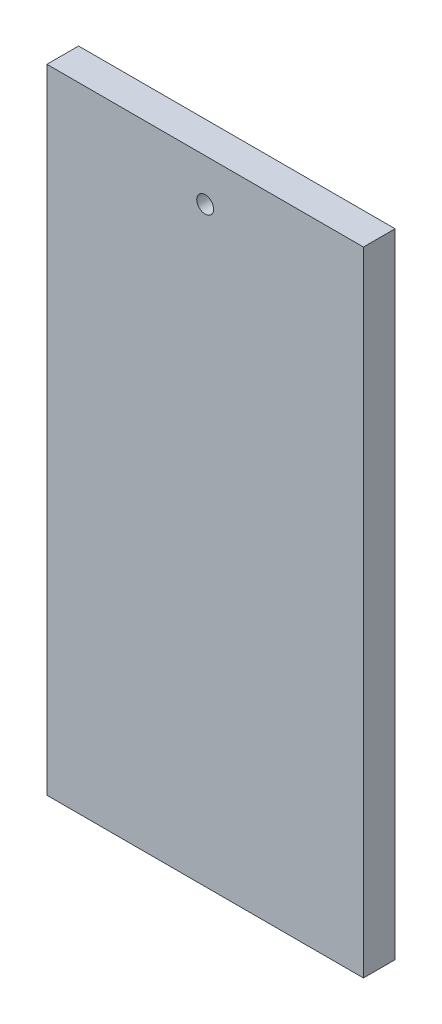
ISO-10303-21;
HEADER;
FILE_DESCRIPTION(('STEP AP214'),'2;1');
FILE_NAME('part.step','',(''),(''),'','','');
FILE_SCHEMA(('AUTOMOTIVE_DESIGN { 1 0 10303 214 1 1 1 1 }'));
ENDSEC;
DATA;
#1=APPLICATION_CONTEXT('core data for automotive mechanical design processes');
#2=APPLICATION_PROTOCOL_DEFINITION('international standard','automotive_design',2000,#1);
#3=PRODUCT_CONTEXT('',#1,'mechanical');
#4=PRODUCT('Part','Part','',(#3));
#5=PRODUCT_RELATED_PRODUCT_CATEGORY('part','',(#4));
#6=PRODUCT_DEFINITION_FORMATION('','',#4);
#7=PRODUCT_DEFINITION_CONTEXT('part definition',#1,'design');
#8=PRODUCT_DEFINITION('design','',#6,#7);
#9=PRODUCT_DEFINITION_SHAPE('','',#8);
#10=(LENGTH_UNIT() NAMED_UNIT(*) SI_UNIT(.MILLI.,.METRE.));
#11=(NAMED_UNIT(*) PLANE_ANGLE_UNIT() SI_UNIT($,.RADIAN.));
#12=(NAMED_UNIT(*) SI_UNIT($,.STERADIAN.) SOLID_ANGLE_UNIT());
#13=UNCERTAINTY_MEASURE_WITH_UNIT(LENGTH_MEASURE(1.E-05),#10,'distance_accuracy_value','');
#14=(GEOMETRIC_REPRESENTATION_CONTEXT(3) GLOBAL_UNCERTAINTY_ASSIGNED_CONTEXT((#13)) GLOBAL_UNIT_ASSIGNED_CONTEXT((#10,
#11,#12)) REPRESENTATION_CONTEXT('',''));
#15=CARTESIAN_POINT('',(0.,0.,0.));
#16=DIRECTION('',(0.,0.,1.));
#17=DIRECTION('',(1.,0.,0.));
#18=AXIS2_PLACEMENT_3D('',#15,#16,#17);
#19=CARTESIAN_POINT('',(0.,0.,15.));
#20=DIRECTION('',(0.,0.,1.));
#21=DIRECTION('',(1.,0.,0.));
#22=AXIS2_PLACEMENT_3D('',#19,#20,#21);
#23=PLANE('',#22);
#24=DIRECTION('',(0.,-1.,0.));
#25=VECTOR('',#24,1.);
#26=CARTESIAN_POINT('',(-75.,-150.,15.));
#27=LINE('',#26,#25);
#28=CARTESIAN_POINT('',(-75.,150.,15.));
#29=VERTEX_POINT('',#28);
#30=CARTESIAN_POINT('',(-75.,-150.,15.));
#31=VERTEX_POINT('',#30);
#32=EDGE_CURVE('E89',#29,#31,#27,.T.);
#33=ORIENTED_EDGE('',*,*,#32,.T.);
#34=DIRECTION('',(1.,0.,0.));
#35=VECTOR('',#34,1.);
#36=CARTESIAN_POINT('',(75.,-150.,15.));
#37=LINE('',#36,#35);
#38=CARTESIAN_POINT('',(75.,-150.,15.));
#39=VERTEX_POINT('',#38);
#40=EDGE_CURVE('E84',#31,#39,#37,.T.);
#41=ORIENTED_EDGE('',*,*,#40,.T.);
#42=DIRECTION('',(0.,1.,0.));
#43=VECTOR('',#42,1.);
#44=CARTESIAN_POINT('',(75.,-150.,15.));
#45=LINE('',#44,#43);
#46=CARTESIAN_POINT('',(75.,150.,15.));
#47=VERTEX_POINT('',#46);
#48=EDGE_CURVE('E87',#39,#47,#45,.T.);
#49=ORIENTED_EDGE('',*,*,#48,.T.);
#50=DIRECTION('',(-1.,0.,0.));
#51=VECTOR('',#50,1.);
#52=CARTESIAN_POINT('',(75.,150.,15.));
#53=LINE('',#52,#51);
#54=EDGE_CURVE('E54',#47,#29,#53,.T.);
#55=ORIENTED_EDGE('',*,*,#54,.T.);
#56=EDGE_LOOP('',(#33,#41,#49,#55));
#57=FACE_BOUND('',#56,.T.);
#58=CARTESIAN_POINT('',(0.,130.,15.));
#59=DIRECTION('',(0.,0.,1.));
#60=DIRECTION('',(1.,0.,0.));
#61=AXIS2_PLACEMENT_3D('',#58,#59,#60);
#62=CIRCLE('',#61,4.);
#63=CARTESIAN_POINT('',(4.,130.,15.));
#64=VERTEX_POINT('',#63);
#65=EDGE_CURVE('E104',#64,#64,#62,.T.);
#66=ORIENTED_EDGE('',*,*,#65,.F.);
#67=EDGE_LOOP('',(#66));
#68=FACE_BOUND('',#67,.T.);
#69=ADVANCED_FACE('F37',(#57,#68),#23,.T.);
#70=CARTESIAN_POINT('',(0.,0.,0.));
#71=DIRECTION('',(0.,0.,1.));
#72=DIRECTION('',(1.,0.,0.));
#73=AXIS2_PLACEMENT_3D('',#70,#71,#72);
#74=PLANE('',#73);
#75=DIRECTION('',(0.,-1.,0.));
#76=VECTOR('',#75,1.);
#77=CARTESIAN_POINT('',(-75.,-150.,0.));
#78=LINE('',#77,#76);
#79=CARTESIAN_POINT('',(-75.,150.,0.));
#80=VERTEX_POINT('',#79);
#81=CARTESIAN_POINT('',(-75.,-150.,0.));
#82=VERTEX_POINT('',#81);
#83=EDGE_CURVE('E101',#80,#82,#78,.T.);
#84=ORIENTED_EDGE('',*,*,#83,.F.);
#85=DIRECTION('',(-1.,0.,0.));
#86=VECTOR('',#85,1.);
#87=CARTESIAN_POINT('',(75.,150.,0.));
#88=LINE('',#87,#86);
#89=CARTESIAN_POINT('',(75.,150.,0.));
#90=VERTEX_POINT('',#89);
#91=EDGE_CURVE('E77',#90,#80,#88,.T.);
#92=ORIENTED_EDGE('',*,*,#91,.F.);
#93=DIRECTION('',(0.,1.,0.));
#94=VECTOR('',#93,1.);
#95=CARTESIAN_POINT('',(75.,-150.,0.));
#96=LINE('',#95,#94);
#97=CARTESIAN_POINT('',(75.,-150.,0.));
#98=VERTEX_POINT('',#97);
#99=EDGE_CURVE('E71',#98,#90,#96,.T.);
#100=ORIENTED_EDGE('',*,*,#99,.F.);
#101=DIRECTION('',(1.,0.,0.));
#102=VECTOR('',#101,1.);
#103=CARTESIAN_POINT('',(75.,-150.,0.));
#104=LINE('',#103,#102);
#105=EDGE_CURVE('E93',#82,#98,#104,.T.);
#106=ORIENTED_EDGE('',*,*,#105,.F.);
#107=EDGE_LOOP('',(#84,#92,#100,#106));
#108=FACE_BOUND('',#107,.T.);
#109=CARTESIAN_POINT('',(0.,130.,0.));
#110=DIRECTION('',(0.,0.,1.));
#111=DIRECTION('',(1.,0.,0.));
#112=AXIS2_PLACEMENT_3D('',#109,#110,#111);
#113=CIRCLE('',#112,4.);
#114=CARTESIAN_POINT('',(4.,130.,0.));
#115=VERTEX_POINT('',#114);
#116=EDGE_CURVE('E116',#115,#115,#113,.T.);
#117=ORIENTED_EDGE('',*,*,#116,.T.);
#118=EDGE_LOOP('',(#117));
#119=FACE_BOUND('',#118,.T.);
#120=ADVANCED_FACE('F112',(#108,#119),#74,.F.);
#121=CARTESIAN_POINT('',(-75.,-150.,15.));
#122=DIRECTION('',(1.,0.,0.));
#123=DIRECTION('',(0.,0.,-1.));
#124=AXIS2_PLACEMENT_3D('',#121,#122,#123);
#125=PLANE('',#124);
#126=ORIENTED_EDGE('',*,*,#83,.T.);
#127=DIRECTION('',(0.,0.,-1.));
#128=VECTOR('',#127,1.);
#129=CARTESIAN_POINT('',(-75.,-150.,15.));
#130=LINE('',#129,#128);
#131=EDGE_CURVE('E11',#31,#82,#130,.T.);
#132=ORIENTED_EDGE('',*,*,#131,.F.);
#133=ORIENTED_EDGE('',*,*,#32,.F.);
#134=DIRECTION('',(0.,0.,-1.));
#135=VECTOR('',#134,1.);
#136=CARTESIAN_POINT('',(-75.,150.,15.));
#137=LINE('',#136,#135);
#138=EDGE_CURVE('E97',#29,#80,#137,.T.);
#139=ORIENTED_EDGE('',*,*,#138,.T.);
#140=EDGE_LOOP('',(#126,#132,#133,#139));
#141=FACE_BOUND('',#140,.T.);
#142=ADVANCED_FACE('F39',(#141),#125,.F.);
#143=CARTESIAN_POINT('',(75.,-150.,15.));
#144=DIRECTION('',(0.,1.,0.));
#145=DIRECTION('',(0.,0.,1.));
#146=AXIS2_PLACEMENT_3D('',#143,#144,#145);
#147=PLANE('',#146);
#148=ORIENTED_EDGE('',*,*,#105,.T.);
#149=DIRECTION('',(0.,0.,-1.));
#150=VECTOR('',#149,1.);
#151=CARTESIAN_POINT('',(75.,-150.,15.));
#152=LINE('',#151,#150);
#153=EDGE_CURVE('E46',#39,#98,#152,.T.);
#154=ORIENTED_EDGE('',*,*,#153,.F.);
#155=ORIENTED_EDGE('',*,*,#40,.F.);
#156=ORIENTED_EDGE('',*,*,#131,.T.);
#157=EDGE_LOOP('',(#148,#154,#155,#156));
#158=FACE_BOUND('',#157,.T.);
#159=ADVANCED_FACE('F92',(#158),#147,.F.);
#160=CARTESIAN_POINT('',(75.,-150.,15.));
#161=DIRECTION('',(-1.,0.,0.));
#162=DIRECTION('',(0.,0.,1.));
#163=AXIS2_PLACEMENT_3D('',#160,#161,#162);
#164=PLANE('',#163);
#165=ORIENTED_EDGE('',*,*,#99,.T.);
#166=DIRECTION('',(0.,0.,-1.));
#167=VECTOR('',#166,1.);
#168=CARTESIAN_POINT('',(75.,150.,15.));
#169=LINE('',#168,#167);
#170=EDGE_CURVE('E94',#47,#90,#169,.T.);
#171=ORIENTED_EDGE('',*,*,#170,.F.);
#172=ORIENTED_EDGE('',*,*,#48,.F.);
#173=ORIENTED_EDGE('',*,*,#153,.T.);
#174=EDGE_LOOP('',(#165,#171,#172,#173));
#175=FACE_BOUND('',#174,.T.);
#176=ADVANCED_FACE('F95',(#175),#164,.F.);
#177=CARTESIAN_POINT('',(75.,150.,15.));
#178=DIRECTION('',(0.,-1.,0.));
#179=DIRECTION('',(1.,0.,0.));
#180=AXIS2_PLACEMENT_3D('',#177,#178,#179);
#181=PLANE('',#180);
#182=ORIENTED_EDGE('',*,*,#91,.T.);
#183=ORIENTED_EDGE('',*,*,#138,.F.);
#184=ORIENTED_EDGE('',*,*,#54,.F.);
#185=ORIENTED_EDGE('',*,*,#170,.T.);
#186=EDGE_LOOP('',(#182,#183,#184,#185));
#187=FACE_BOUND('',#186,.T.);
#188=ADVANCED_FACE('F109',(#187),#181,.F.);
#189=CARTESIAN_POINT('',(0.,130.,15.));
#190=DIRECTION('',(0.,0.,-1.));
#191=DIRECTION('',(-1.,0.,0.));
#192=AXIS2_PLACEMENT_3D('',#189,#190,#191);
#193=CYLINDRICAL_SURFACE('',#192,4.);
#194=ORIENTED_EDGE('',*,*,#65,.T.);
#195=EDGE_LOOP('',(#194));
#196=FACE_BOUND('',#195,.T.);
#197=ORIENTED_EDGE('',*,*,#116,.F.);
#198=EDGE_LOOP('',(#197));
#199=FACE_BOUND('',#198,.T.);
#200=ADVANCED_FACE('F122',(#196,#199),#193,.F.);
#201=CLOSED_SHELL('',(#69,#120,#142,#159,#176,#188,#200));
#202=MANIFOLD_SOLID_BREP('B2',#201);
#203=ADVANCED_BREP_SHAPE_REPRESENTATION('',(#18,#202),#14);
#204=SHAPE_DEFINITION_REPRESENTATION(#9,#203);
ENDSEC;
END-ISO-10303-21;
